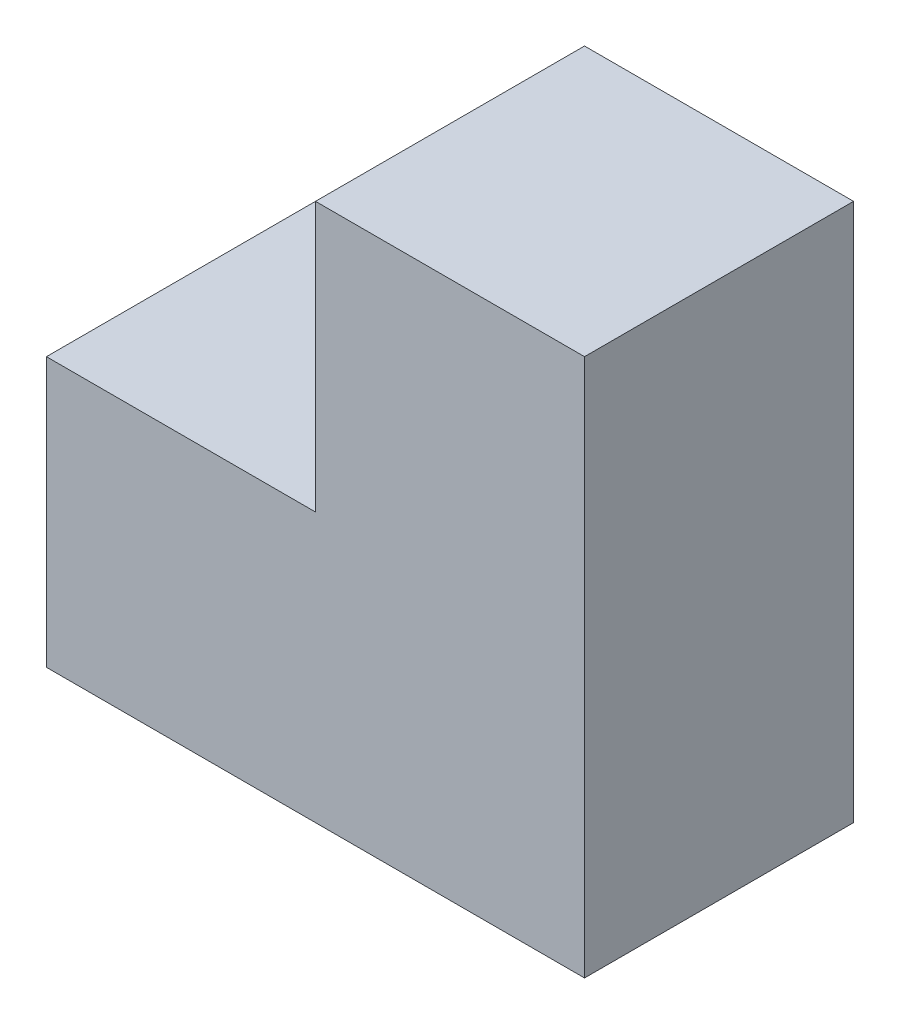
ISO-10303-21;
HEADER;
FILE_DESCRIPTION(('STEP AP214'),'2;1');
FILE_NAME('part.step','',(''),(''),'','','');
FILE_SCHEMA(('AUTOMOTIVE_DESIGN { 1 0 10303 214 1 1 1 1 }'));
ENDSEC;
DATA;
#1=APPLICATION_CONTEXT('core data for automotive mechanical design processes');
#2=APPLICATION_PROTOCOL_DEFINITION('international standard','automotive_design',2000,#1);
#3=PRODUCT_CONTEXT('',#1,'mechanical');
#4=PRODUCT('Part','Part','',(#3));
#5=PRODUCT_RELATED_PRODUCT_CATEGORY('part','',(#4));
#6=PRODUCT_DEFINITION_FORMATION('','',#4);
#7=PRODUCT_DEFINITION_CONTEXT('part definition',#1,'design');
#8=PRODUCT_DEFINITION('design','',#6,#7);
#9=PRODUCT_DEFINITION_SHAPE('','',#8);
#10=(LENGTH_UNIT() NAMED_UNIT(*) SI_UNIT(.MILLI.,.METRE.));
#11=(NAMED_UNIT(*) PLANE_ANGLE_UNIT() SI_UNIT($,.RADIAN.));
#12=(NAMED_UNIT(*) SI_UNIT($,.STERADIAN.) SOLID_ANGLE_UNIT());
#13=UNCERTAINTY_MEASURE_WITH_UNIT(LENGTH_MEASURE(1.E-05),#10,'distance_accuracy_value','');
#14=(GEOMETRIC_REPRESENTATION_CONTEXT(3) GLOBAL_UNCERTAINTY_ASSIGNED_CONTEXT((#13)) GLOBAL_UNIT_ASSIGNED_CONTEXT((#10,
#11,#12)) REPRESENTATION_CONTEXT('',''));
#15=CARTESIAN_POINT('',(0.,0.,0.));
#16=DIRECTION('',(0.,0.,1.));
#17=DIRECTION('',(1.,0.,0.));
#18=AXIS2_PLACEMENT_3D('',#15,#16,#17);
#19=CARTESIAN_POINT('',(19.05,19.05,19.05));
#20=DIRECTION('',(0.,-1.,0.));
#21=DIRECTION('',(0.,0.,-1.));
#22=AXIS2_PLACEMENT_3D('',#19,#20,#21);
#23=PLANE('',#22);
#24=DIRECTION('',(-1.,0.,0.));
#25=VECTOR('',#24,1.);
#26=CARTESIAN_POINT('',(19.05,19.05,0.));
#27=LINE('',#26,#25);
#28=CARTESIAN_POINT('',(19.05,19.05,0.));
#29=VERTEX_POINT('',#28);
#30=CARTESIAN_POINT('',(0.,19.05,0.));
#31=VERTEX_POINT('',#30);
#32=EDGE_CURVE('E130',#29,#31,#27,.T.);
#33=ORIENTED_EDGE('',*,*,#32,.T.);
#34=DIRECTION('',(0.,0.,-1.));
#35=VECTOR('',#34,1.);
#36=CARTESIAN_POINT('',(0.,19.05,19.05));
#37=LINE('',#36,#35);
#38=CARTESIAN_POINT('',(0.,19.05,19.05));
#39=VERTEX_POINT('',#38);
#40=EDGE_CURVE('E11',#39,#31,#37,.T.);
#41=ORIENTED_EDGE('',*,*,#40,.F.);
#42=DIRECTION('',(-1.,0.,0.));
#43=VECTOR('',#42,1.);
#44=CARTESIAN_POINT('',(19.05,19.05,19.05));
#45=LINE('',#44,#43);
#46=CARTESIAN_POINT('',(19.05,19.05,19.05));
#47=VERTEX_POINT('',#46);
#48=EDGE_CURVE('E140',#47,#39,#45,.T.);
#49=ORIENTED_EDGE('',*,*,#48,.F.);
#50=DIRECTION('',(0.,0.,-1.));
#51=VECTOR('',#50,1.);
#52=CARTESIAN_POINT('',(19.05,19.05,19.05));
#53=LINE('',#52,#51);
#54=EDGE_CURVE('E121',#47,#29,#53,.T.);
#55=ORIENTED_EDGE('',*,*,#54,.T.);
#56=EDGE_LOOP('',(#33,#41,#49,#55));
#57=FACE_BOUND('',#56,.T.);
#58=ADVANCED_FACE('F43',(#57),#23,.F.);
#59=CARTESIAN_POINT('',(0.,19.05,19.05));
#60=DIRECTION('',(1.,0.,0.));
#61=DIRECTION('',(0.,0.,-1.));
#62=AXIS2_PLACEMENT_3D('',#59,#60,#61);
#63=PLANE('',#62);
#64=DIRECTION('',(0.,-1.,0.));
#65=VECTOR('',#64,1.);
#66=CARTESIAN_POINT('',(0.,19.05,0.));
#67=LINE('',#66,#65);
#68=CARTESIAN_POINT('',(0.,0.,0.));
#69=VERTEX_POINT('',#68);
#70=EDGE_CURVE('E127',#31,#69,#67,.T.);
#71=ORIENTED_EDGE('',*,*,#70,.T.);
#72=DIRECTION('',(0.,0.,-1.));
#73=VECTOR('',#72,1.);
#74=CARTESIAN_POINT('',(0.,0.,19.05));
#75=LINE('',#74,#73);
#76=CARTESIAN_POINT('',(0.,0.,19.05));
#77=VERTEX_POINT('',#76);
#78=EDGE_CURVE('E51',#77,#69,#75,.T.);
#79=ORIENTED_EDGE('',*,*,#78,.F.);
#80=DIRECTION('',(0.,-1.,0.));
#81=VECTOR('',#80,1.);
#82=CARTESIAN_POINT('',(0.,19.05,19.05));
#83=LINE('',#82,#81);
#84=EDGE_CURVE('E96',#39,#77,#83,.T.);
#85=ORIENTED_EDGE('',*,*,#84,.F.);
#86=ORIENTED_EDGE('',*,*,#40,.T.);
#87=EDGE_LOOP('',(#71,#79,#85,#86));
#88=FACE_BOUND('',#87,.T.);
#89=ADVANCED_FACE('F161',(#88),#63,.F.);
#90=CARTESIAN_POINT('',(0.,0.,19.05));
#91=DIRECTION('',(0.,1.,0.));
#92=DIRECTION('',(0.,0.,1.));
#93=AXIS2_PLACEMENT_3D('',#90,#91,#92);
#94=PLANE('',#93);
#95=DIRECTION('',(1.,0.,0.));
#96=VECTOR('',#95,1.);
#97=CARTESIAN_POINT('',(0.,0.,0.));
#98=LINE('',#97,#96);
#99=CARTESIAN_POINT('',(38.1,0.,0.));
#100=VERTEX_POINT('',#99);
#101=EDGE_CURVE('E135',#69,#100,#98,.T.);
#102=ORIENTED_EDGE('',*,*,#101,.T.);
#103=DIRECTION('',(0.,0.,-1.));
#104=VECTOR('',#103,1.);
#105=CARTESIAN_POINT('',(38.1,0.,19.05));
#106=LINE('',#105,#104);
#107=CARTESIAN_POINT('',(38.1,0.,19.05));
#108=VERTEX_POINT('',#107);
#109=EDGE_CURVE('E119',#108,#100,#106,.T.);
#110=ORIENTED_EDGE('',*,*,#109,.F.);
#111=DIRECTION('',(1.,0.,0.));
#112=VECTOR('',#111,1.);
#113=CARTESIAN_POINT('',(0.,0.,19.05));
#114=LINE('',#113,#112);
#115=EDGE_CURVE('E108',#77,#108,#114,.T.);
#116=ORIENTED_EDGE('',*,*,#115,.F.);
#117=ORIENTED_EDGE('',*,*,#78,.T.);
#118=EDGE_LOOP('',(#102,#110,#116,#117));
#119=FACE_BOUND('',#118,.T.);
#120=ADVANCED_FACE('F142',(#119),#94,.F.);
#121=CARTESIAN_POINT('',(38.1,0.,19.05));
#122=DIRECTION('',(-1.,0.,0.));
#123=DIRECTION('',(0.,0.,1.));
#124=AXIS2_PLACEMENT_3D('',#121,#122,#123);
#125=PLANE('',#124);
#126=DIRECTION('',(0.,1.,0.));
#127=VECTOR('',#126,1.);
#128=CARTESIAN_POINT('',(38.1,0.,0.));
#129=LINE('',#128,#127);
#130=CARTESIAN_POINT('',(38.1,38.1,0.));
#131=VERTEX_POINT('',#130);
#132=EDGE_CURVE('E117',#100,#131,#129,.T.);
#133=ORIENTED_EDGE('',*,*,#132,.T.);
#134=DIRECTION('',(0.,0.,-1.));
#135=VECTOR('',#134,1.);
#136=CARTESIAN_POINT('',(38.1,38.1,19.05));
#137=LINE('',#136,#135);
#138=CARTESIAN_POINT('',(38.1,38.1,19.05));
#139=VERTEX_POINT('',#138);
#140=EDGE_CURVE('E114',#139,#131,#137,.T.);
#141=ORIENTED_EDGE('',*,*,#140,.F.);
#142=DIRECTION('',(0.,1.,0.));
#143=VECTOR('',#142,1.);
#144=CARTESIAN_POINT('',(38.1,0.,19.05));
#145=LINE('',#144,#143);
#146=EDGE_CURVE('E104',#108,#139,#145,.T.);
#147=ORIENTED_EDGE('',*,*,#146,.F.);
#148=ORIENTED_EDGE('',*,*,#109,.T.);
#149=EDGE_LOOP('',(#133,#141,#147,#148));
#150=FACE_BOUND('',#149,.T.);
#151=ADVANCED_FACE('F113',(#150),#125,.F.);
#152=CARTESIAN_POINT('',(38.1,38.1,19.05));
#153=DIRECTION('',(0.,-1.,0.));
#154=DIRECTION('',(0.,0.,-1.));
#155=AXIS2_PLACEMENT_3D('',#152,#153,#154);
#156=PLANE('',#155);
#157=DIRECTION('',(-1.,0.,0.));
#158=VECTOR('',#157,1.);
#159=CARTESIAN_POINT('',(38.1,38.1,0.));
#160=LINE('',#159,#158);
#161=CARTESIAN_POINT('',(19.05,38.1,0.));
#162=VERTEX_POINT('',#161);
#163=EDGE_CURVE('E85',#131,#162,#160,.T.);
#164=ORIENTED_EDGE('',*,*,#163,.T.);
#165=DIRECTION('',(0.,0.,-1.));
#166=VECTOR('',#165,1.);
#167=CARTESIAN_POINT('',(19.05,38.1,19.05));
#168=LINE('',#167,#166);
#169=CARTESIAN_POINT('',(19.05,38.1,19.05));
#170=VERTEX_POINT('',#169);
#171=EDGE_CURVE('E118',#170,#162,#168,.T.);
#172=ORIENTED_EDGE('',*,*,#171,.F.);
#173=DIRECTION('',(-1.,0.,0.));
#174=VECTOR('',#173,1.);
#175=CARTESIAN_POINT('',(38.1,38.1,19.05));
#176=LINE('',#175,#174);
#177=EDGE_CURVE('E107',#139,#170,#176,.T.);
#178=ORIENTED_EDGE('',*,*,#177,.F.);
#179=ORIENTED_EDGE('',*,*,#140,.T.);
#180=EDGE_LOOP('',(#164,#172,#178,#179));
#181=FACE_BOUND('',#180,.T.);
#182=ADVANCED_FACE('F123',(#181),#156,.F.);
#183=CARTESIAN_POINT('',(19.05,38.1,19.05));
#184=DIRECTION('',(1.,0.,0.));
#185=DIRECTION('',(0.,0.,-1.));
#186=AXIS2_PLACEMENT_3D('',#183,#184,#185);
#187=PLANE('',#186);
#188=DIRECTION('',(0.,-1.,0.));
#189=VECTOR('',#188,1.);
#190=CARTESIAN_POINT('',(19.05,38.1,0.));
#191=LINE('',#190,#189);
#192=EDGE_CURVE('E88',#162,#29,#191,.T.);
#193=ORIENTED_EDGE('',*,*,#192,.T.);
#194=ORIENTED_EDGE('',*,*,#54,.F.);
#195=DIRECTION('',(0.,-1.,0.));
#196=VECTOR('',#195,1.);
#197=CARTESIAN_POINT('',(19.05,38.1,19.05));
#198=LINE('',#197,#196);
#199=EDGE_CURVE('E56',#170,#47,#198,.T.);
#200=ORIENTED_EDGE('',*,*,#199,.F.);
#201=ORIENTED_EDGE('',*,*,#171,.T.);
#202=EDGE_LOOP('',(#193,#194,#200,#201));
#203=FACE_BOUND('',#202,.T.);
#204=ADVANCED_FACE('F148',(#203),#187,.F.);
#205=CARTESIAN_POINT('',(0.,0.,19.05));
#206=DIRECTION('',(0.,0.,1.));
#207=DIRECTION('',(1.,0.,0.));
#208=AXIS2_PLACEMENT_3D('',#205,#206,#207);
#209=PLANE('',#208);
#210=ORIENTED_EDGE('',*,*,#48,.T.);
#211=ORIENTED_EDGE('',*,*,#84,.T.);
#212=ORIENTED_EDGE('',*,*,#115,.T.);
#213=ORIENTED_EDGE('',*,*,#146,.T.);
#214=ORIENTED_EDGE('',*,*,#177,.T.);
#215=ORIENTED_EDGE('',*,*,#199,.T.);
#216=EDGE_LOOP('',(#210,#211,#212,#213,#214,#215));
#217=FACE_BOUND('',#216,.T.);
#218=ADVANCED_FACE('F103',(#217),#209,.T.);
#219=CARTESIAN_POINT('',(0.,0.,0.));
#220=DIRECTION('',(0.,0.,1.));
#221=DIRECTION('',(1.,0.,0.));
#222=AXIS2_PLACEMENT_3D('',#219,#220,#221);
#223=PLANE('',#222);
#224=ORIENTED_EDGE('',*,*,#32,.F.);
#225=ORIENTED_EDGE('',*,*,#192,.F.);
#226=ORIENTED_EDGE('',*,*,#163,.F.);
#227=ORIENTED_EDGE('',*,*,#132,.F.);
#228=ORIENTED_EDGE('',*,*,#101,.F.);
#229=ORIENTED_EDGE('',*,*,#70,.F.);
#230=EDGE_LOOP('',(#224,#225,#226,#227,#228,#229));
#231=FACE_BOUND('',#230,.T.);
#232=ADVANCED_FACE('F147',(#231),#223,.F.);
#233=CLOSED_SHELL('',(#58,#89,#120,#151,#182,#204,#218,#232));
#234=MANIFOLD_SOLID_BREP('B2',#233);
#235=ADVANCED_BREP_SHAPE_REPRESENTATION('',(#18,#234),#14);
#236=SHAPE_DEFINITION_REPRESENTATION(#9,#235);
ENDSEC;
END-ISO-10303-21;
